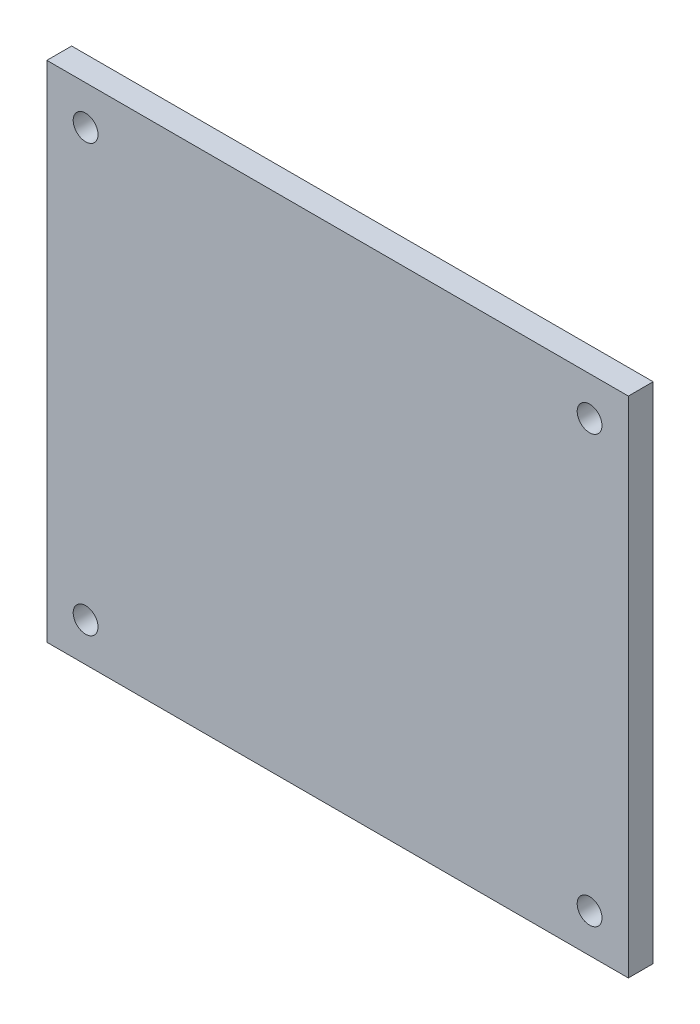
ISO-10303-21;
HEADER;
FILE_DESCRIPTION(('STEP AP214'),'2;1');
FILE_NAME('part.step','',(''),(''),'','','');
FILE_SCHEMA(('AUTOMOTIVE_DESIGN { 1 0 10303 214 1 1 1 1 }'));
ENDSEC;
DATA;
#1=APPLICATION_CONTEXT('core data for automotive mechanical design processes');
#2=APPLICATION_PROTOCOL_DEFINITION('international standard','automotive_design',2000,#1);
#3=PRODUCT_CONTEXT('',#1,'mechanical');
#4=PRODUCT('Part','Part','',(#3));
#5=PRODUCT_RELATED_PRODUCT_CATEGORY('part','',(#4));
#6=PRODUCT_DEFINITION_FORMATION('','',#4);
#7=PRODUCT_DEFINITION_CONTEXT('part definition',#1,'design');
#8=PRODUCT_DEFINITION('design','',#6,#7);
#9=PRODUCT_DEFINITION_SHAPE('','',#8);
#10=(LENGTH_UNIT() NAMED_UNIT(*) SI_UNIT(.MILLI.,.METRE.));
#11=(NAMED_UNIT(*) PLANE_ANGLE_UNIT() SI_UNIT($,.RADIAN.));
#12=(NAMED_UNIT(*) SI_UNIT($,.STERADIAN.) SOLID_ANGLE_UNIT());
#13=UNCERTAINTY_MEASURE_WITH_UNIT(LENGTH_MEASURE(1.E-05),#10,'distance_accuracy_value','');
#14=(GEOMETRIC_REPRESENTATION_CONTEXT(3) GLOBAL_UNCERTAINTY_ASSIGNED_CONTEXT((#13)) GLOBAL_UNIT_ASSIGNED_CONTEXT((#10,
#11,#12)) REPRESENTATION_CONTEXT('',''));
#15=CARTESIAN_POINT('',(0.,0.,0.));
#16=DIRECTION('',(0.,0.,1.));
#17=DIRECTION('',(1.,0.,0.));
#18=AXIS2_PLACEMENT_3D('',#15,#16,#17);
#19=CARTESIAN_POINT('',(-37.5,32.5,-3.20000000000001));
#20=DIRECTION('',(-1.,0.,0.));
#21=DIRECTION('',(0.,-1.,0.));
#22=AXIS2_PLACEMENT_3D('',#19,#20,#21);
#23=PLANE('',#22);
#24=DIRECTION('',(0.,-1.,0.));
#25=VECTOR('',#24,1.);
#26=CARTESIAN_POINT('',(-37.5,32.5,0.));
#27=LINE('',#26,#25);
#28=CARTESIAN_POINT('',(-37.5,32.5,0.));
#29=VERTEX_POINT('',#28);
#30=CARTESIAN_POINT('',(-37.5,-32.5000000000001,0.));
#31=VERTEX_POINT('',#30);
#32=EDGE_CURVE('E112',#29,#31,#27,.T.);
#33=ORIENTED_EDGE('',*,*,#32,.F.);
#34=DIRECTION('',(0.,0.,0.999999999999997));
#35=VECTOR('',#34,1.);
#36=CARTESIAN_POINT('',(-37.5,32.5,-3.20000000000001));
#37=LINE('',#36,#35);
#38=CARTESIAN_POINT('',(-37.5,32.5,-3.20000000000001));
#39=VERTEX_POINT('',#38);
#40=EDGE_CURVE('E11',#39,#29,#37,.T.);
#41=ORIENTED_EDGE('',*,*,#40,.F.);
#42=DIRECTION('',(0.,-1.,0.));
#43=VECTOR('',#42,1.);
#44=CARTESIAN_POINT('',(-37.5,32.5,-3.20000000000001));
#45=LINE('',#44,#43);
#46=CARTESIAN_POINT('',(-37.5,-32.5000000000001,-3.20000000000001));
#47=VERTEX_POINT('',#46);
#48=EDGE_CURVE('E102',#39,#47,#45,.T.);
#49=ORIENTED_EDGE('',*,*,#48,.T.);
#50=DIRECTION('',(0.,0.,0.999999999999997));
#51=VECTOR('',#50,1.);
#52=CARTESIAN_POINT('',(-37.5,-32.5000000000001,-3.20000000000001));
#53=LINE('',#52,#51);
#54=EDGE_CURVE('E43',#47,#31,#53,.T.);
#55=ORIENTED_EDGE('',*,*,#54,.T.);
#56=EDGE_LOOP('',(#33,#41,#49,#55));
#57=FACE_BOUND('',#56,.T.);
#58=ADVANCED_FACE('F40',(#57),#23,.T.);
#59=CARTESIAN_POINT('',(37.5,32.5,-3.20000000000001));
#60=DIRECTION('',(0.,1.,0.));
#61=DIRECTION('',(-1.,0.,0.));
#62=AXIS2_PLACEMENT_3D('',#59,#60,#61);
#63=PLANE('',#62);
#64=DIRECTION('',(-1.,0.,0.));
#65=VECTOR('',#64,1.);
#66=CARTESIAN_POINT('',(37.5,32.5,0.));
#67=LINE('',#66,#65);
#68=CARTESIAN_POINT('',(37.5,32.5,0.));
#69=VERTEX_POINT('',#68);
#70=EDGE_CURVE('E106',#69,#29,#67,.T.);
#71=ORIENTED_EDGE('',*,*,#70,.F.);
#72=DIRECTION('',(0.,0.,0.999999999999997));
#73=VECTOR('',#72,1.);
#74=CARTESIAN_POINT('',(37.5,32.5,-3.20000000000001));
#75=LINE('',#74,#73);
#76=CARTESIAN_POINT('',(37.5,32.5,-3.20000000000001));
#77=VERTEX_POINT('',#76);
#78=EDGE_CURVE('E50',#77,#69,#75,.T.);
#79=ORIENTED_EDGE('',*,*,#78,.F.);
#80=DIRECTION('',(-1.,0.,0.));
#81=VECTOR('',#80,1.);
#82=CARTESIAN_POINT('',(37.5,32.5,-3.20000000000001));
#83=LINE('',#82,#81);
#84=EDGE_CURVE('E97',#77,#39,#83,.T.);
#85=ORIENTED_EDGE('',*,*,#84,.T.);
#86=ORIENTED_EDGE('',*,*,#40,.T.);
#87=EDGE_LOOP('',(#71,#79,#85,#86));
#88=FACE_BOUND('',#87,.T.);
#89=ADVANCED_FACE('F135',(#88),#63,.T.);
#90=CARTESIAN_POINT('',(37.5,32.5,-3.20000000000001));
#91=DIRECTION('',(1.,0.,0.));
#92=DIRECTION('',(0.,1.,0.));
#93=AXIS2_PLACEMENT_3D('',#90,#91,#92);
#94=PLANE('',#93);
#95=DIRECTION('',(0.,1.,0.));
#96=VECTOR('',#95,1.);
#97=CARTESIAN_POINT('',(37.5,32.5,0.));
#98=LINE('',#97,#96);
#99=CARTESIAN_POINT('',(37.5,-32.5,0.));
#100=VERTEX_POINT('',#99);
#101=EDGE_CURVE('E91',#100,#69,#98,.T.);
#102=ORIENTED_EDGE('',*,*,#101,.F.);
#103=DIRECTION('',(0.,0.,0.999999999999997));
#104=VECTOR('',#103,1.);
#105=CARTESIAN_POINT('',(37.5,-32.5,-3.20000000000001));
#106=LINE('',#105,#104);
#107=CARTESIAN_POINT('',(37.5,-32.5,-3.20000000000001));
#108=VERTEX_POINT('',#107);
#109=EDGE_CURVE('E86',#108,#100,#106,.T.);
#110=ORIENTED_EDGE('',*,*,#109,.F.);
#111=DIRECTION('',(0.,1.,0.));
#112=VECTOR('',#111,1.);
#113=CARTESIAN_POINT('',(37.5,32.5,-3.20000000000001));
#114=LINE('',#113,#112);
#115=EDGE_CURVE('E89',#108,#77,#114,.T.);
#116=ORIENTED_EDGE('',*,*,#115,.T.);
#117=ORIENTED_EDGE('',*,*,#78,.T.);
#118=EDGE_LOOP('',(#102,#110,#116,#117));
#119=FACE_BOUND('',#118,.T.);
#120=ADVANCED_FACE('F88',(#119),#94,.T.);
#121=CARTESIAN_POINT('',(37.5,-32.5,-3.20000000000001));
#122=DIRECTION('',(0.,-1.,0.));
#123=DIRECTION('',(1.,0.,0.));
#124=AXIS2_PLACEMENT_3D('',#121,#122,#123);
#125=PLANE('',#124);
#126=DIRECTION('',(1.,0.,0.));
#127=VECTOR('',#126,1.);
#128=CARTESIAN_POINT('',(37.5,-32.5,0.));
#129=LINE('',#128,#127);
#130=EDGE_CURVE('E116',#31,#100,#129,.T.);
#131=ORIENTED_EDGE('',*,*,#130,.F.);
#132=ORIENTED_EDGE('',*,*,#54,.F.);
#133=DIRECTION('',(1.,0.,0.));
#134=VECTOR('',#133,1.);
#135=CARTESIAN_POINT('',(37.5,-32.5,-3.20000000000001));
#136=LINE('',#135,#134);
#137=EDGE_CURVE('E96',#47,#108,#136,.T.);
#138=ORIENTED_EDGE('',*,*,#137,.T.);
#139=ORIENTED_EDGE('',*,*,#109,.T.);
#140=EDGE_LOOP('',(#131,#132,#138,#139));
#141=FACE_BOUND('',#140,.T.);
#142=ADVANCED_FACE('F100',(#141),#125,.T.);
#143=CARTESIAN_POINT('',(0.,0.,-3.20000000000001));
#144=DIRECTION('',(0.,0.,-0.999999999999997));
#145=DIRECTION('',(-1.,0.,0.));
#146=AXIS2_PLACEMENT_3D('',#143,#144,#145);
#147=PLANE('',#146);
#148=CARTESIAN_POINT('',(-32.5,27.5,-3.20000000000001));
#149=DIRECTION('',(0.,0.,0.999999999999997));
#150=DIRECTION('',(1.,0.,0.));
#151=AXIS2_PLACEMENT_3D('',#148,#149,#150);
#152=CIRCLE('',#151,1.6);
#153=CARTESIAN_POINT('',(-30.9,27.5,-3.20000000000001));
#154=VERTEX_POINT('',#153);
#155=EDGE_CURVE('E176',#154,#154,#152,.T.);
#156=ORIENTED_EDGE('',*,*,#155,.T.);
#157=EDGE_LOOP('',(#156));
#158=FACE_BOUND('',#157,.T.);
#159=CARTESIAN_POINT('',(-32.5,-27.5000000000001,-3.20000000000001));
#160=DIRECTION('',(0.,0.,0.999999999999997));
#161=DIRECTION('',(1.,0.,0.));
#162=AXIS2_PLACEMENT_3D('',#159,#160,#161);
#163=CIRCLE('',#162,1.6);
#164=CARTESIAN_POINT('',(-30.9,-27.5000000000001,-3.20000000000001));
#165=VERTEX_POINT('',#164);
#166=EDGE_CURVE('E190',#165,#165,#163,.T.);
#167=ORIENTED_EDGE('',*,*,#166,.T.);
#168=EDGE_LOOP('',(#167));
#169=FACE_BOUND('',#168,.T.);
#170=CARTESIAN_POINT('',(32.5,-27.5,-3.20000000000001));
#171=DIRECTION('',(0.,0.,0.999999999999997));
#172=DIRECTION('',(1.,0.,0.));
#173=AXIS2_PLACEMENT_3D('',#170,#171,#172);
#174=CIRCLE('',#173,1.6);
#175=CARTESIAN_POINT('',(34.1,-27.5,-3.20000000000001));
#176=VERTEX_POINT('',#175);
#177=EDGE_CURVE('E198',#176,#176,#174,.T.);
#178=ORIENTED_EDGE('',*,*,#177,.T.);
#179=EDGE_LOOP('',(#178));
#180=FACE_BOUND('',#179,.T.);
#181=CARTESIAN_POINT('',(32.5,27.5,-3.20000000000001));
#182=DIRECTION('',(0.,0.,0.999999999999997));
#183=DIRECTION('',(1.,0.,0.));
#184=AXIS2_PLACEMENT_3D('',#181,#182,#183);
#185=CIRCLE('',#184,1.6);
#186=CARTESIAN_POINT('',(34.1,27.5,-3.20000000000001));
#187=VERTEX_POINT('',#186);
#188=EDGE_CURVE('E117',#187,#187,#185,.T.);
#189=ORIENTED_EDGE('',*,*,#188,.T.);
#190=EDGE_LOOP('',(#189));
#191=FACE_BOUND('',#190,.T.);
#192=ORIENTED_EDGE('',*,*,#48,.F.);
#193=ORIENTED_EDGE('',*,*,#84,.F.);
#194=ORIENTED_EDGE('',*,*,#115,.F.);
#195=ORIENTED_EDGE('',*,*,#137,.F.);
#196=EDGE_LOOP('',(#192,#193,#194,#195));
#197=FACE_BOUND('',#196,.T.);
#198=ADVANCED_FACE('F95',(#158,#169,#180,#191,#197),#147,.T.);
#199=CARTESIAN_POINT('',(0.,0.,0.));
#200=DIRECTION('',(0.,0.,-0.999999999999997));
#201=DIRECTION('',(-1.,0.,0.));
#202=AXIS2_PLACEMENT_3D('',#199,#200,#201);
#203=PLANE('',#202);
#204=CARTESIAN_POINT('',(-32.5,27.5,0.));
#205=DIRECTION('',(0.,0.,0.999999999999997));
#206=DIRECTION('',(1.,0.,0.));
#207=AXIS2_PLACEMENT_3D('',#204,#205,#206);
#208=CIRCLE('',#207,1.6);
#209=CARTESIAN_POINT('',(-30.9,27.5,0.));
#210=VERTEX_POINT('',#209);
#211=EDGE_CURVE('E179',#210,#210,#208,.T.);
#212=ORIENTED_EDGE('',*,*,#211,.F.);
#213=EDGE_LOOP('',(#212));
#214=FACE_BOUND('',#213,.T.);
#215=CARTESIAN_POINT('',(-32.5,-27.5000000000001,0.));
#216=DIRECTION('',(0.,0.,0.999999999999997));
#217=DIRECTION('',(1.,0.,0.));
#218=AXIS2_PLACEMENT_3D('',#215,#216,#217);
#219=CIRCLE('',#218,1.6);
#220=CARTESIAN_POINT('',(-30.9,-27.5000000000001,0.));
#221=VERTEX_POINT('',#220);
#222=EDGE_CURVE('E184',#221,#221,#219,.T.);
#223=ORIENTED_EDGE('',*,*,#222,.F.);
#224=EDGE_LOOP('',(#223));
#225=FACE_BOUND('',#224,.T.);
#226=CARTESIAN_POINT('',(32.5,-27.5,0.));
#227=DIRECTION('',(0.,0.,0.999999999999997));
#228=DIRECTION('',(1.,0.,0.));
#229=AXIS2_PLACEMENT_3D('',#226,#227,#228);
#230=CIRCLE('',#229,1.6);
#231=CARTESIAN_POINT('',(34.1,-27.5,0.));
#232=VERTEX_POINT('',#231);
#233=EDGE_CURVE('E194',#232,#232,#230,.T.);
#234=ORIENTED_EDGE('',*,*,#233,.F.);
#235=EDGE_LOOP('',(#234));
#236=FACE_BOUND('',#235,.T.);
#237=CARTESIAN_POINT('',(32.5,27.5,0.));
#238=DIRECTION('',(0.,0.,0.999999999999997));
#239=DIRECTION('',(1.,0.,0.));
#240=AXIS2_PLACEMENT_3D('',#237,#238,#239);
#241=CIRCLE('',#240,1.6);
#242=CARTESIAN_POINT('',(34.1,27.5,0.));
#243=VERTEX_POINT('',#242);
#244=EDGE_CURVE('E202',#243,#243,#241,.T.);
#245=ORIENTED_EDGE('',*,*,#244,.F.);
#246=EDGE_LOOP('',(#245));
#247=FACE_BOUND('',#246,.T.);
#248=ORIENTED_EDGE('',*,*,#32,.T.);
#249=ORIENTED_EDGE('',*,*,#130,.T.);
#250=ORIENTED_EDGE('',*,*,#101,.T.);
#251=ORIENTED_EDGE('',*,*,#70,.T.);
#252=EDGE_LOOP('',(#248,#249,#250,#251));
#253=FACE_BOUND('',#252,.T.);
#254=ADVANCED_FACE('F134',(#214,#225,#236,#247,#253),#203,.F.);
#255=CARTESIAN_POINT('',(32.5,27.5,0.));
#256=DIRECTION('',(0.,0.,0.999999999999997));
#257=DIRECTION('',(1.,0.,0.));
#258=AXIS2_PLACEMENT_3D('',#255,#256,#257);
#259=CYLINDRICAL_SURFACE('',#258,1.6);
#260=CARTESIAN_POINT('',(34.1,27.5,-3.20000000000001));
#261=CARTESIAN_POINT('',(34.1,27.5,-3.16666666666667));
#262=CARTESIAN_POINT('',(34.1,27.5,-3.13333333333334));
#263=CARTESIAN_POINT('',(34.1,27.5,-3.06666666666667));
#264=CARTESIAN_POINT('',(34.1,27.5,-3.03333333333334));
#265=CARTESIAN_POINT('',(34.1,27.5,-2.96666666666667));
#266=CARTESIAN_POINT('',(34.1,27.5,-2.93333333333334));
#267=CARTESIAN_POINT('',(34.1,27.5,-2.86666666666667));
#268=CARTESIAN_POINT('',(34.1,27.5,-2.83333333333334));
#269=CARTESIAN_POINT('',(34.1,27.5,-2.76666666666667));
#270=CARTESIAN_POINT('',(34.1,27.5,-2.73333333333334));
#271=CARTESIAN_POINT('',(34.1,27.5,-2.66666666666667));
#272=CARTESIAN_POINT('',(34.1,27.5,-2.63333333333334));
#273=CARTESIAN_POINT('',(34.1,27.5,-2.56666666666667));
#274=CARTESIAN_POINT('',(34.1,27.5,-2.53333333333334));
#275=CARTESIAN_POINT('',(34.1,27.5,-2.46666666666667));
#276=CARTESIAN_POINT('',(34.1,27.5,-2.43333333333334));
#277=CARTESIAN_POINT('',(34.1,27.5,-2.36666666666667));
#278=CARTESIAN_POINT('',(34.1,27.5,-2.33333333333334));
#279=CARTESIAN_POINT('',(34.1,27.5,-2.26666666666667));
#280=CARTESIAN_POINT('',(34.1,27.5,-2.23333333333334));
#281=CARTESIAN_POINT('',(34.1,27.5,-2.16666666666667));
#282=CARTESIAN_POINT('',(34.1,27.5,-2.13333333333334));
#283=CARTESIAN_POINT('',(34.1,27.5,-2.06666666666667));
#284=CARTESIAN_POINT('',(34.1,27.5,-2.03333333333334));
#285=CARTESIAN_POINT('',(34.1,27.5,-1.96666666666667));
#286=CARTESIAN_POINT('',(34.1,27.5,-1.93333333333334));
#287=CARTESIAN_POINT('',(34.1,27.5,-1.86666666666667));
#288=CARTESIAN_POINT('',(34.1,27.5,-1.83333333333334));
#289=CARTESIAN_POINT('',(34.1,27.5,-1.76666666666667));
#290=CARTESIAN_POINT('',(34.1,27.5,-1.73333333333334));
#291=CARTESIAN_POINT('',(34.1,27.5,-1.66666666666667));
#292=CARTESIAN_POINT('',(34.1,27.5,-1.63333333333334));
#293=CARTESIAN_POINT('',(34.1,27.5,-1.56666666666667));
#294=CARTESIAN_POINT('',(34.1,27.5,-1.53333333333334));
#295=CARTESIAN_POINT('',(34.1,27.5,-1.46666666666667));
#296=CARTESIAN_POINT('',(34.1,27.5,-1.43333333333334));
#297=CARTESIAN_POINT('',(34.1,27.5,-1.36666666666667));
#298=CARTESIAN_POINT('',(34.1,27.5,-1.33333333333334));
#299=CARTESIAN_POINT('',(34.1,27.5,-1.26666666666667));
#300=CARTESIAN_POINT('',(34.1,27.5,-1.23333333333334));
#301=CARTESIAN_POINT('',(34.1,27.5,-1.16666666666667));
#302=CARTESIAN_POINT('',(34.1,27.5,-1.13333333333334));
#303=CARTESIAN_POINT('',(34.1,27.5,-1.06666666666667));
#304=CARTESIAN_POINT('',(34.1,27.5,-1.03333333333334));
#305=CARTESIAN_POINT('',(34.1,27.5,-0.966666666666669));
#306=CARTESIAN_POINT('',(34.1,27.5,-0.933333333333336));
#307=CARTESIAN_POINT('',(34.1,27.5,-0.866666666666669));
#308=CARTESIAN_POINT('',(34.1,27.5,-0.833333333333336));
#309=CARTESIAN_POINT('',(34.1,27.5,-0.766666666666669));
#310=CARTESIAN_POINT('',(34.1,27.5,-0.733333333333335));
#311=CARTESIAN_POINT('',(34.1,27.5,-0.666666666666668));
#312=CARTESIAN_POINT('',(34.1,27.5,-0.633333333333335));
#313=CARTESIAN_POINT('',(34.1,27.5,-0.566666666666668));
#314=CARTESIAN_POINT('',(34.1,27.5,-0.533333333333335));
#315=CARTESIAN_POINT('',(34.1,27.5,-0.466666666666668));
#316=CARTESIAN_POINT('',(34.1,27.5,-0.433333333333334));
#317=CARTESIAN_POINT('',(34.1,27.5,-0.366666666666667));
#318=CARTESIAN_POINT('',(34.1,27.5,-0.333333333333334));
#319=CARTESIAN_POINT('',(34.1,27.5,-0.266666666666667));
#320=CARTESIAN_POINT('',(34.1,27.5,-0.233333333333334));
#321=CARTESIAN_POINT('',(34.1,27.5,-0.166666666666667));
#322=CARTESIAN_POINT('',(34.1,27.5,-0.133333333333334));
#323=CARTESIAN_POINT('',(34.1,27.5,-0.0666666666666669));
#324=CARTESIAN_POINT('',(34.1,27.5,-0.0333333333333335));
#325=CARTESIAN_POINT('',(34.1,27.5,0.));
#326=B_SPLINE_CURVE_WITH_KNOTS('',3,(#260,#261,#262,#263,#264,#265,#266,#267,#268,#269,#270,
#271,#272,#273,#274,#275,#276,#277,#278,#279,#280,#281,#282,#283,#284,#285,#286,#287,#288,#289,
#290,#291,#292,#293,#294,#295,#296,#297,#298,#299,#300,#301,#302,#303,#304,#305,#306,#307,#308,
#309,#310,#311,#312,#313,#314,#315,#316,#317,#318,#319,#320,#321,#322,#323,#324,#325),
.UNSPECIFIED.,.F.,.F.,(4,2,2,2,2,2,2,2,2,2,2,2,2,2,2,2,2,2,2,2,2,2,2,2,2,2,2,2,2,2,2,2,4),(0.,
0.1,0.2,0.300000000000001,0.400000000000001,0.500000000000001,0.600000000000002,
0.700000000000001,0.800000000000002,0.900000000000002,1.,1.1,1.2,1.3,1.4,1.5,1.6,1.7,1.8,
1.90000000000001,2.00000000000001,2.10000000000001,2.20000000000001,2.30000000000001,
2.40000000000001,2.50000000000001,2.60000000000001,2.70000000000001,2.80000000000001,
2.90000000000001,3.00000000000001,3.10000000000001,3.20000000000001),.UNSPECIFIED.);
#327=EDGE_CURVE('BSEAM153',#187,#243,#326,.T.);
#328=ORIENTED_EDGE('',*,*,#188,.F.);
#329=ORIENTED_EDGE('',*,*,#244,.T.);
#330=ORIENTED_EDGE('',*,*,#327,.T.);
#331=ORIENTED_EDGE('',*,*,#327,.F.);
#332=EDGE_LOOP('',(#328,#330,#329,#331));
#333=FACE_BOUND('',#332,.T.);
#334=ADVANCED_FACE('F153',(#333),#259,.F.);
#335=CARTESIAN_POINT('',(32.5,-27.5,0.));
#336=DIRECTION('',(0.,0.,0.999999999999997));
#337=DIRECTION('',(1.,0.,0.));
#338=AXIS2_PLACEMENT_3D('',#335,#336,#337);
#339=CYLINDRICAL_SURFACE('',#338,1.6);
#340=CARTESIAN_POINT('',(34.1,-27.5,-3.20000000000001));
#341=CARTESIAN_POINT('',(34.1,-27.5,-3.16666666666667));
#342=CARTESIAN_POINT('',(34.1,-27.5,-3.13333333333334));
#343=CARTESIAN_POINT('',(34.1,-27.5,-3.06666666666667));
#344=CARTESIAN_POINT('',(34.1,-27.5,-3.03333333333334));
#345=CARTESIAN_POINT('',(34.1,-27.5,-2.96666666666667));
#346=CARTESIAN_POINT('',(34.1,-27.5,-2.93333333333334));
#347=CARTESIAN_POINT('',(34.1,-27.5,-2.86666666666667));
#348=CARTESIAN_POINT('',(34.1,-27.5,-2.83333333333334));
#349=CARTESIAN_POINT('',(34.1,-27.5,-2.76666666666667));
#350=CARTESIAN_POINT('',(34.1,-27.5,-2.73333333333334));
#351=CARTESIAN_POINT('',(34.1,-27.5,-2.66666666666667));
#352=CARTESIAN_POINT('',(34.1,-27.5,-2.63333333333334));
#353=CARTESIAN_POINT('',(34.1,-27.5,-2.56666666666667));
#354=CARTESIAN_POINT('',(34.1,-27.5,-2.53333333333334));
#355=CARTESIAN_POINT('',(34.1,-27.5,-2.46666666666667));
#356=CARTESIAN_POINT('',(34.1,-27.5,-2.43333333333334));
#357=CARTESIAN_POINT('',(34.1,-27.5,-2.36666666666667));
#358=CARTESIAN_POINT('',(34.1,-27.5,-2.33333333333334));
#359=CARTESIAN_POINT('',(34.1,-27.5,-2.26666666666667));
#360=CARTESIAN_POINT('',(34.1,-27.5,-2.23333333333334));
#361=CARTESIAN_POINT('',(34.1,-27.5,-2.16666666666667));
#362=CARTESIAN_POINT('',(34.1,-27.5,-2.13333333333334));
#363=CARTESIAN_POINT('',(34.1,-27.5,-2.06666666666667));
#364=CARTESIAN_POINT('',(34.1,-27.5,-2.03333333333334));
#365=CARTESIAN_POINT('',(34.1,-27.5,-1.96666666666667));
#366=CARTESIAN_POINT('',(34.1,-27.5,-1.93333333333334));
#367=CARTESIAN_POINT('',(34.1,-27.5,-1.86666666666667));
#368=CARTESIAN_POINT('',(34.1,-27.5,-1.83333333333334));
#369=CARTESIAN_POINT('',(34.1,-27.5,-1.76666666666667));
#370=CARTESIAN_POINT('',(34.1,-27.5,-1.73333333333334));
#371=CARTESIAN_POINT('',(34.1,-27.5,-1.66666666666667));
#372=CARTESIAN_POINT('',(34.1,-27.5,-1.63333333333334));
#373=CARTESIAN_POINT('',(34.1,-27.5,-1.56666666666667));
#374=CARTESIAN_POINT('',(34.1,-27.5,-1.53333333333334));
#375=CARTESIAN_POINT('',(34.1,-27.5,-1.46666666666667));
#376=CARTESIAN_POINT('',(34.1,-27.5,-1.43333333333334));
#377=CARTESIAN_POINT('',(34.1,-27.5,-1.36666666666667));
#378=CARTESIAN_POINT('',(34.1,-27.5,-1.33333333333334));
#379=CARTESIAN_POINT('',(34.1,-27.5,-1.26666666666667));
#380=CARTESIAN_POINT('',(34.1,-27.5,-1.23333333333334));
#381=CARTESIAN_POINT('',(34.1,-27.5,-1.16666666666667));
#382=CARTESIAN_POINT('',(34.1,-27.5,-1.13333333333334));
#383=CARTESIAN_POINT('',(34.1,-27.5,-1.06666666666667));
#384=CARTESIAN_POINT('',(34.1,-27.5,-1.03333333333334));
#385=CARTESIAN_POINT('',(34.1,-27.5,-0.966666666666669));
#386=CARTESIAN_POINT('',(34.1,-27.5,-0.933333333333336));
#387=CARTESIAN_POINT('',(34.1,-27.5,-0.866666666666669));
#388=CARTESIAN_POINT('',(34.1,-27.5,-0.833333333333336));
#389=CARTESIAN_POINT('',(34.1,-27.5,-0.766666666666669));
#390=CARTESIAN_POINT('',(34.1,-27.5,-0.733333333333335));
#391=CARTESIAN_POINT('',(34.1,-27.5,-0.666666666666668));
#392=CARTESIAN_POINT('',(34.1,-27.5,-0.633333333333335));
#393=CARTESIAN_POINT('',(34.1,-27.5,-0.566666666666668));
#394=CARTESIAN_POINT('',(34.1,-27.5,-0.533333333333335));
#395=CARTESIAN_POINT('',(34.1,-27.5,-0.466666666666668));
#396=CARTESIAN_POINT('',(34.1,-27.5,-0.433333333333334));
#397=CARTESIAN_POINT('',(34.1,-27.5,-0.366666666666667));
#398=CARTESIAN_POINT('',(34.1,-27.5,-0.333333333333334));
#399=CARTESIAN_POINT('',(34.1,-27.5,-0.266666666666667));
#400=CARTESIAN_POINT('',(34.1,-27.5,-0.233333333333334));
#401=CARTESIAN_POINT('',(34.1,-27.5,-0.166666666666667));
#402=CARTESIAN_POINT('',(34.1,-27.5,-0.133333333333334));
#403=CARTESIAN_POINT('',(34.1,-27.5,-0.0666666666666669));
#404=CARTESIAN_POINT('',(34.1,-27.5,-0.0333333333333335));
#405=CARTESIAN_POINT('',(34.1,-27.5,0.));
#406=B_SPLINE_CURVE_WITH_KNOTS('',3,(#340,#341,#342,#343,#344,#345,#346,#347,#348,#349,#350,
#351,#352,#353,#354,#355,#356,#357,#358,#359,#360,#361,#362,#363,#364,#365,#366,#367,#368,#369,
#370,#371,#372,#373,#374,#375,#376,#377,#378,#379,#380,#381,#382,#383,#384,#385,#386,#387,#388,
#389,#390,#391,#392,#393,#394,#395,#396,#397,#398,#399,#400,#401,#402,#403,#404,#405),
.UNSPECIFIED.,.F.,.F.,(4,2,2,2,2,2,2,2,2,2,2,2,2,2,2,2,2,2,2,2,2,2,2,2,2,2,2,2,2,2,2,2,4),(0.,
0.1,0.2,0.300000000000001,0.400000000000001,0.500000000000001,0.600000000000002,
0.700000000000001,0.800000000000002,0.900000000000002,1.,1.1,1.2,1.3,1.4,1.5,1.6,1.7,1.8,
1.90000000000001,2.00000000000001,2.10000000000001,2.20000000000001,2.30000000000001,
2.40000000000001,2.50000000000001,2.60000000000001,2.70000000000001,2.80000000000001,
2.90000000000001,3.00000000000001,3.10000000000001,3.20000000000001),.UNSPECIFIED.);
#407=EDGE_CURVE('BSEAM160',#176,#232,#406,.T.);
#408=ORIENTED_EDGE('',*,*,#177,.F.);
#409=ORIENTED_EDGE('',*,*,#233,.T.);
#410=ORIENTED_EDGE('',*,*,#407,.T.);
#411=ORIENTED_EDGE('',*,*,#407,.F.);
#412=EDGE_LOOP('',(#408,#410,#409,#411));
#413=FACE_BOUND('',#412,.T.);
#414=ADVANCED_FACE('F160',(#413),#339,.F.);
#415=CARTESIAN_POINT('',(-32.5,-27.5000000000001,0.));
#416=DIRECTION('',(0.,0.,0.999999999999997));
#417=DIRECTION('',(1.,0.,0.));
#418=AXIS2_PLACEMENT_3D('',#415,#416,#417);
#419=CYLINDRICAL_SURFACE('',#418,1.6);
#420=CARTESIAN_POINT('',(-30.9,-27.5000000000001,-3.20000000000001));
#421=CARTESIAN_POINT('',(-30.9,-27.5000000000001,-3.16666666666667));
#422=CARTESIAN_POINT('',(-30.9,-27.5000000000001,-3.13333333333334));
#423=CARTESIAN_POINT('',(-30.9,-27.5000000000001,-3.06666666666667));
#424=CARTESIAN_POINT('',(-30.9,-27.5000000000001,-3.03333333333334));
#425=CARTESIAN_POINT('',(-30.9,-27.5000000000001,-2.96666666666667));
#426=CARTESIAN_POINT('',(-30.9,-27.5000000000001,-2.93333333333334));
#427=CARTESIAN_POINT('',(-30.9,-27.5000000000001,-2.86666666666667));
#428=CARTESIAN_POINT('',(-30.9,-27.5000000000001,-2.83333333333334));
#429=CARTESIAN_POINT('',(-30.9,-27.5000000000001,-2.76666666666667));
#430=CARTESIAN_POINT('',(-30.9,-27.5000000000001,-2.73333333333334));
#431=CARTESIAN_POINT('',(-30.9,-27.5000000000001,-2.66666666666667));
#432=CARTESIAN_POINT('',(-30.9,-27.5000000000001,-2.63333333333334));
#433=CARTESIAN_POINT('',(-30.9,-27.5000000000001,-2.56666666666667));
#434=CARTESIAN_POINT('',(-30.9,-27.5000000000001,-2.53333333333334));
#435=CARTESIAN_POINT('',(-30.9,-27.5000000000001,-2.46666666666667));
#436=CARTESIAN_POINT('',(-30.9,-27.5000000000001,-2.43333333333334));
#437=CARTESIAN_POINT('',(-30.9,-27.5000000000001,-2.36666666666667));
#438=CARTESIAN_POINT('',(-30.9,-27.5000000000001,-2.33333333333334));
#439=CARTESIAN_POINT('',(-30.9,-27.5000000000001,-2.26666666666667));
#440=CARTESIAN_POINT('',(-30.9,-27.5000000000001,-2.23333333333334));
#441=CARTESIAN_POINT('',(-30.9,-27.5000000000001,-2.16666666666667));
#442=CARTESIAN_POINT('',(-30.9,-27.5000000000001,-2.13333333333334));
#443=CARTESIAN_POINT('',(-30.9,-27.5000000000001,-2.06666666666667));
#444=CARTESIAN_POINT('',(-30.9,-27.5000000000001,-2.03333333333334));
#445=CARTESIAN_POINT('',(-30.9,-27.5000000000001,-1.96666666666667));
#446=CARTESIAN_POINT('',(-30.9,-27.5000000000001,-1.93333333333334));
#447=CARTESIAN_POINT('',(-30.9,-27.5000000000001,-1.86666666666667));
#448=CARTESIAN_POINT('',(-30.9,-27.5000000000001,-1.83333333333334));
#449=CARTESIAN_POINT('',(-30.9,-27.5000000000001,-1.76666666666667));
#450=CARTESIAN_POINT('',(-30.9,-27.5000000000001,-1.73333333333334));
#451=CARTESIAN_POINT('',(-30.9,-27.5000000000001,-1.66666666666667));
#452=CARTESIAN_POINT('',(-30.9,-27.5000000000001,-1.63333333333334));
#453=CARTESIAN_POINT('',(-30.9,-27.5000000000001,-1.56666666666667));
#454=CARTESIAN_POINT('',(-30.9,-27.5000000000001,-1.53333333333334));
#455=CARTESIAN_POINT('',(-30.9,-27.5000000000001,-1.46666666666667));
#456=CARTESIAN_POINT('',(-30.9,-27.5000000000001,-1.43333333333334));
#457=CARTESIAN_POINT('',(-30.9,-27.5000000000001,-1.36666666666667));
#458=CARTESIAN_POINT('',(-30.9,-27.5000000000001,-1.33333333333334));
#459=CARTESIAN_POINT('',(-30.9,-27.5000000000001,-1.26666666666667));
#460=CARTESIAN_POINT('',(-30.9,-27.5000000000001,-1.23333333333334));
#461=CARTESIAN_POINT('',(-30.9,-27.5000000000001,-1.16666666666667));
#462=CARTESIAN_POINT('',(-30.9,-27.5000000000001,-1.13333333333334));
#463=CARTESIAN_POINT('',(-30.9,-27.5000000000001,-1.06666666666667));
#464=CARTESIAN_POINT('',(-30.9,-27.5000000000001,-1.03333333333334));
#465=CARTESIAN_POINT('',(-30.9,-27.5000000000001,-0.966666666666669));
#466=CARTESIAN_POINT('',(-30.9,-27.5000000000001,-0.933333333333336));
#467=CARTESIAN_POINT('',(-30.9,-27.5000000000001,-0.866666666666669));
#468=CARTESIAN_POINT('',(-30.9,-27.5000000000001,-0.833333333333336));
#469=CARTESIAN_POINT('',(-30.9,-27.5000000000001,-0.766666666666669));
#470=CARTESIAN_POINT('',(-30.9,-27.5000000000001,-0.733333333333335));
#471=CARTESIAN_POINT('',(-30.9,-27.5000000000001,-0.666666666666668));
#472=CARTESIAN_POINT('',(-30.9,-27.5000000000001,-0.633333333333335));
#473=CARTESIAN_POINT('',(-30.9,-27.5000000000001,-0.566666666666668));
#474=CARTESIAN_POINT('',(-30.9,-27.5000000000001,-0.533333333333335));
#475=CARTESIAN_POINT('',(-30.9,-27.5000000000001,-0.466666666666668));
#476=CARTESIAN_POINT('',(-30.9,-27.5000000000001,-0.433333333333334));
#477=CARTESIAN_POINT('',(-30.9,-27.5000000000001,-0.366666666666667));
#478=CARTESIAN_POINT('',(-30.9,-27.5000000000001,-0.333333333333334));
#479=CARTESIAN_POINT('',(-30.9,-27.5000000000001,-0.266666666666667));
#480=CARTESIAN_POINT('',(-30.9,-27.5000000000001,-0.233333333333334));
#481=CARTESIAN_POINT('',(-30.9,-27.5000000000001,-0.166666666666667));
#482=CARTESIAN_POINT('',(-30.9,-27.5000000000001,-0.133333333333334));
#483=CARTESIAN_POINT('',(-30.9,-27.5000000000001,-0.0666666666666669));
#484=CARTESIAN_POINT('',(-30.9,-27.5000000000001,-0.0333333333333335));
#485=CARTESIAN_POINT('',(-30.9,-27.5000000000001,0.));
#486=B_SPLINE_CURVE_WITH_KNOTS('',3,(#420,#421,#422,#423,#424,#425,#426,#427,#428,#429,#430,
#431,#432,#433,#434,#435,#436,#437,#438,#439,#440,#441,#442,#443,#444,#445,#446,#447,#448,#449,
#450,#451,#452,#453,#454,#455,#456,#457,#458,#459,#460,#461,#462,#463,#464,#465,#466,#467,#468,
#469,#470,#471,#472,#473,#474,#475,#476,#477,#478,#479,#480,#481,#482,#483,#484,#485),
.UNSPECIFIED.,.F.,.F.,(4,2,2,2,2,2,2,2,2,2,2,2,2,2,2,2,2,2,2,2,2,2,2,2,2,2,2,2,2,2,2,2,4),(0.,
0.1,0.2,0.300000000000001,0.400000000000001,0.500000000000001,0.600000000000002,
0.700000000000001,0.800000000000002,0.900000000000002,1.,1.1,1.2,1.3,1.4,1.5,1.6,1.7,1.8,
1.90000000000001,2.00000000000001,2.10000000000001,2.20000000000001,2.30000000000001,
2.40000000000001,2.50000000000001,2.60000000000001,2.70000000000001,2.80000000000001,
2.90000000000001,3.00000000000001,3.10000000000001,3.20000000000001),.UNSPECIFIED.);
#487=EDGE_CURVE('BSEAM164',#165,#221,#486,.T.);
#488=ORIENTED_EDGE('',*,*,#166,.F.);
#489=ORIENTED_EDGE('',*,*,#222,.T.);
#490=ORIENTED_EDGE('',*,*,#487,.T.);
#491=ORIENTED_EDGE('',*,*,#487,.F.);
#492=EDGE_LOOP('',(#488,#490,#489,#491));
#493=FACE_BOUND('',#492,.T.);
#494=ADVANCED_FACE('F164',(#493),#419,.F.);
#495=CARTESIAN_POINT('',(-32.5,27.5,0.));
#496=DIRECTION('',(0.,0.,0.999999999999997));
#497=DIRECTION('',(1.,0.,0.));
#498=AXIS2_PLACEMENT_3D('',#495,#496,#497);
#499=CYLINDRICAL_SURFACE('',#498,1.6);
#500=CARTESIAN_POINT('',(-30.9,27.5,-3.20000000000001));
#501=CARTESIAN_POINT('',(-30.9,27.5,-3.16666666666667));
#502=CARTESIAN_POINT('',(-30.9,27.5,-3.13333333333334));
#503=CARTESIAN_POINT('',(-30.9,27.5,-3.06666666666667));
#504=CARTESIAN_POINT('',(-30.9,27.5,-3.03333333333334));
#505=CARTESIAN_POINT('',(-30.9,27.5,-2.96666666666667));
#506=CARTESIAN_POINT('',(-30.9,27.5,-2.93333333333334));
#507=CARTESIAN_POINT('',(-30.9,27.5,-2.86666666666667));
#508=CARTESIAN_POINT('',(-30.9,27.5,-2.83333333333334));
#509=CARTESIAN_POINT('',(-30.9,27.5,-2.76666666666667));
#510=CARTESIAN_POINT('',(-30.9,27.5,-2.73333333333334));
#511=CARTESIAN_POINT('',(-30.9,27.5,-2.66666666666667));
#512=CARTESIAN_POINT('',(-30.9,27.5,-2.63333333333334));
#513=CARTESIAN_POINT('',(-30.9,27.5,-2.56666666666667));
#514=CARTESIAN_POINT('',(-30.9,27.5,-2.53333333333334));
#515=CARTESIAN_POINT('',(-30.9,27.5,-2.46666666666667));
#516=CARTESIAN_POINT('',(-30.9,27.5,-2.43333333333334));
#517=CARTESIAN_POINT('',(-30.9,27.5,-2.36666666666667));
#518=CARTESIAN_POINT('',(-30.9,27.5,-2.33333333333334));
#519=CARTESIAN_POINT('',(-30.9,27.5,-2.26666666666667));
#520=CARTESIAN_POINT('',(-30.9,27.5,-2.23333333333334));
#521=CARTESIAN_POINT('',(-30.9,27.5,-2.16666666666667));
#522=CARTESIAN_POINT('',(-30.9,27.5,-2.13333333333334));
#523=CARTESIAN_POINT('',(-30.9,27.5,-2.06666666666667));
#524=CARTESIAN_POINT('',(-30.9,27.5,-2.03333333333334));
#525=CARTESIAN_POINT('',(-30.9,27.5,-1.96666666666667));
#526=CARTESIAN_POINT('',(-30.9,27.5,-1.93333333333334));
#527=CARTESIAN_POINT('',(-30.9,27.5,-1.86666666666667));
#528=CARTESIAN_POINT('',(-30.9,27.5,-1.83333333333334));
#529=CARTESIAN_POINT('',(-30.9,27.5,-1.76666666666667));
#530=CARTESIAN_POINT('',(-30.9,27.5,-1.73333333333334));
#531=CARTESIAN_POINT('',(-30.9,27.5,-1.66666666666667));
#532=CARTESIAN_POINT('',(-30.9,27.5,-1.63333333333334));
#533=CARTESIAN_POINT('',(-30.9,27.5,-1.56666666666667));
#534=CARTESIAN_POINT('',(-30.9,27.5,-1.53333333333334));
#535=CARTESIAN_POINT('',(-30.9,27.5,-1.46666666666667));
#536=CARTESIAN_POINT('',(-30.9,27.5,-1.43333333333334));
#537=CARTESIAN_POINT('',(-30.9,27.5,-1.36666666666667));
#538=CARTESIAN_POINT('',(-30.9,27.5,-1.33333333333334));
#539=CARTESIAN_POINT('',(-30.9,27.5,-1.26666666666667));
#540=CARTESIAN_POINT('',(-30.9,27.5,-1.23333333333334));
#541=CARTESIAN_POINT('',(-30.9,27.5,-1.16666666666667));
#542=CARTESIAN_POINT('',(-30.9,27.5,-1.13333333333334));
#543=CARTESIAN_POINT('',(-30.9,27.5,-1.06666666666667));
#544=CARTESIAN_POINT('',(-30.9,27.5,-1.03333333333334));
#545=CARTESIAN_POINT('',(-30.9,27.5,-0.966666666666669));
#546=CARTESIAN_POINT('',(-30.9,27.5,-0.933333333333336));
#547=CARTESIAN_POINT('',(-30.9,27.5,-0.866666666666669));
#548=CARTESIAN_POINT('',(-30.9,27.5,-0.833333333333336));
#549=CARTESIAN_POINT('',(-30.9,27.5,-0.766666666666669));
#550=CARTESIAN_POINT('',(-30.9,27.5,-0.733333333333335));
#551=CARTESIAN_POINT('',(-30.9,27.5,-0.666666666666668));
#552=CARTESIAN_POINT('',(-30.9,27.5,-0.633333333333335));
#553=CARTESIAN_POINT('',(-30.9,27.5,-0.566666666666668));
#554=CARTESIAN_POINT('',(-30.9,27.5,-0.533333333333335));
#555=CARTESIAN_POINT('',(-30.9,27.5,-0.466666666666668));
#556=CARTESIAN_POINT('',(-30.9,27.5,-0.433333333333334));
#557=CARTESIAN_POINT('',(-30.9,27.5,-0.366666666666667));
#558=CARTESIAN_POINT('',(-30.9,27.5,-0.333333333333334));
#559=CARTESIAN_POINT('',(-30.9,27.5,-0.266666666666667));
#560=CARTESIAN_POINT('',(-30.9,27.5,-0.233333333333334));
#561=CARTESIAN_POINT('',(-30.9,27.5,-0.166666666666667));
#562=CARTESIAN_POINT('',(-30.9,27.5,-0.133333333333334));
#563=CARTESIAN_POINT('',(-30.9,27.5,-0.0666666666666669));
#564=CARTESIAN_POINT('',(-30.9,27.5,-0.0333333333333335));
#565=CARTESIAN_POINT('',(-30.9,27.5,0.));
#566=B_SPLINE_CURVE_WITH_KNOTS('',3,(#500,#501,#502,#503,#504,#505,#506,#507,#508,#509,#510,
#511,#512,#513,#514,#515,#516,#517,#518,#519,#520,#521,#522,#523,#524,#525,#526,#527,#528,#529,
#530,#531,#532,#533,#534,#535,#536,#537,#538,#539,#540,#541,#542,#543,#544,#545,#546,#547,#548,
#549,#550,#551,#552,#553,#554,#555,#556,#557,#558,#559,#560,#561,#562,#563,#564,#565),
.UNSPECIFIED.,.F.,.F.,(4,2,2,2,2,2,2,2,2,2,2,2,2,2,2,2,2,2,2,2,2,2,2,2,2,2,2,2,2,2,2,2,4),(0.,
0.1,0.2,0.300000000000001,0.400000000000001,0.500000000000001,0.600000000000002,
0.700000000000001,0.800000000000002,0.900000000000002,1.,1.1,1.2,1.3,1.4,1.5,1.6,1.7,1.8,
1.90000000000001,2.00000000000001,2.10000000000001,2.20000000000001,2.30000000000001,
2.40000000000001,2.50000000000001,2.60000000000001,2.70000000000001,2.80000000000001,
2.90000000000001,3.00000000000001,3.10000000000001,3.20000000000001),.UNSPECIFIED.);
#567=EDGE_CURVE('BSEAM168',#154,#210,#566,.T.);
#568=ORIENTED_EDGE('',*,*,#155,.F.);
#569=ORIENTED_EDGE('',*,*,#211,.T.);
#570=ORIENTED_EDGE('',*,*,#567,.T.);
#571=ORIENTED_EDGE('',*,*,#567,.F.);
#572=EDGE_LOOP('',(#568,#570,#569,#571));
#573=FACE_BOUND('',#572,.T.);
#574=ADVANCED_FACE('F168',(#573),#499,.F.);
#575=CLOSED_SHELL('',(#58,#89,#120,#142,#198,#254,#334,#414,#494,#574));
#576=MANIFOLD_SOLID_BREP('B2',#575);
#577=ADVANCED_BREP_SHAPE_REPRESENTATION('',(#18,#576),#14);
#578=SHAPE_DEFINITION_REPRESENTATION(#9,#577);
ENDSEC;
END-ISO-10303-21;
